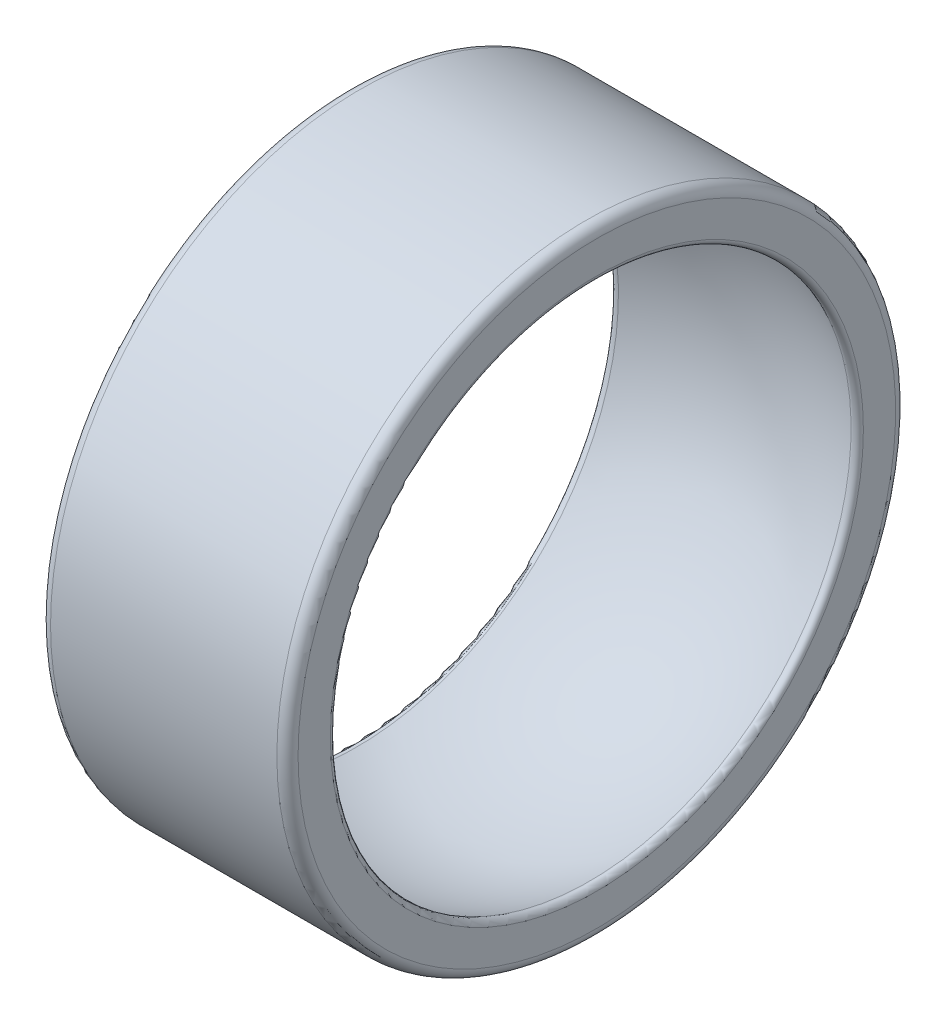
ISO-10303-21;
HEADER;
FILE_DESCRIPTION(('STEP AP214'),'2;1');
FILE_NAME('part.step','',(''),(''),'','','');
FILE_SCHEMA(('AUTOMOTIVE_DESIGN { 1 0 10303 214 1 1 1 1 }'));
ENDSEC;
DATA;
#1=APPLICATION_CONTEXT('core data for automotive mechanical design processes');
#2=APPLICATION_PROTOCOL_DEFINITION('international standard','automotive_design',2000,#1);
#3=PRODUCT_CONTEXT('',#1,'mechanical');
#4=PRODUCT('Part','Part','',(#3));
#5=PRODUCT_RELATED_PRODUCT_CATEGORY('part','',(#4));
#6=PRODUCT_DEFINITION_FORMATION('','',#4);
#7=PRODUCT_DEFINITION_CONTEXT('part definition',#1,'design');
#8=PRODUCT_DEFINITION('design','',#6,#7);
#9=PRODUCT_DEFINITION_SHAPE('','',#8);
#10=(LENGTH_UNIT() NAMED_UNIT(*) SI_UNIT(.MILLI.,.METRE.));
#11=(NAMED_UNIT(*) PLANE_ANGLE_UNIT() SI_UNIT($,.RADIAN.));
#12=(NAMED_UNIT(*) SI_UNIT($,.STERADIAN.) SOLID_ANGLE_UNIT());
#13=UNCERTAINTY_MEASURE_WITH_UNIT(LENGTH_MEASURE(1.E-05),#10,'distance_accuracy_value','');
#14=(GEOMETRIC_REPRESENTATION_CONTEXT(3) GLOBAL_UNCERTAINTY_ASSIGNED_CONTEXT((#13)) GLOBAL_UNIT_ASSIGNED_CONTEXT((#10,
#11,#12)) REPRESENTATION_CONTEXT('',''));
#15=CARTESIAN_POINT('',(0.,0.,0.));
#16=DIRECTION('',(0.,0.,1.));
#17=DIRECTION('',(1.,0.,0.));
#18=AXIS2_PLACEMENT_3D('',#15,#16,#17);
#19=CARTESIAN_POINT('',(0.6,0.,0.));
#20=DIRECTION('',(-1.,0.,0.));
#21=DIRECTION('',(0.,0.,1.));
#22=AXIS2_PLACEMENT_3D('',#19,#20,#21);
#23=TOROIDAL_SURFACE('',#22,16.9,0.6);
#24=CARTESIAN_POINT('',(0.,0.,0.));
#25=DIRECTION('',(-1.,0.,0.));
#26=DIRECTION('',(0.,0.,1.));
#27=AXIS2_PLACEMENT_3D('',#24,#25,#26);
#28=CIRCLE('',#27,16.9);
#29=CARTESIAN_POINT('',(0.,0.,16.9));
#30=VERTEX_POINT('',#29);
#31=EDGE_CURVE('E10',#30,#30,#28,.T.);
#32=ORIENTED_EDGE('',*,*,#31,.F.);
#33=EDGE_LOOP('',(#32));
#34=FACE_BOUND('',#33,.T.);
#35=CARTESIAN_POINT('',(0.6,0.,0.));
#36=DIRECTION('',(-1.,0.,0.));
#37=DIRECTION('',(0.,0.,1.));
#38=AXIS2_PLACEMENT_3D('',#35,#36,#37);
#39=CIRCLE('',#38,17.5);
#40=CARTESIAN_POINT('',(0.6,0.,17.5));
#41=VERTEX_POINT('',#40);
#42=EDGE_CURVE('E56',#41,#41,#39,.T.);
#43=ORIENTED_EDGE('',*,*,#42,.T.);
#44=EDGE_LOOP('',(#43));
#45=FACE_BOUND('',#44,.T.);
#46=ADVANCED_FACE('F14',(#34,#45),#23,.T.);
#47=CARTESIAN_POINT('',(0.,16.9,0.));
#48=DIRECTION('',(1.,0.,0.));
#49=DIRECTION('',(0.,0.,-1.));
#50=AXIS2_PLACEMENT_3D('',#47,#48,#49);
#51=PLANE('',#50);
#52=CARTESIAN_POINT('',(0.,0.,0.));
#53=DIRECTION('',(-1.,0.,0.));
#54=DIRECTION('',(0.,0.,1.));
#55=AXIS2_PLACEMENT_3D('',#52,#53,#54);
#56=CIRCLE('',#55,15.0753468294497);
#57=CARTESIAN_POINT('',(0.,0.,15.0753468294497));
#58=VERTEX_POINT('',#57);
#59=EDGE_CURVE('E21',#58,#58,#56,.T.);
#60=ORIENTED_EDGE('',*,*,#59,.F.);
#61=EDGE_LOOP('',(#60));
#62=FACE_BOUND('',#61,.T.);
#63=ORIENTED_EDGE('',*,*,#31,.T.);
#64=EDGE_LOOP('',(#63));
#65=FACE_BOUND('',#64,.T.);
#66=ADVANCED_FACE('F95',(#62,#65),#51,.F.);
#67=CARTESIAN_POINT('',(0.3,0.,0.));
#68=DIRECTION('',(-1.,0.,0.));
#69=DIRECTION('',(0.,0.,1.));
#70=AXIS2_PLACEMENT_3D('',#67,#68,#69);
#71=TOROIDAL_SURFACE('',#70,15.0753468294497,0.3);
#72=CARTESIAN_POINT('',(0.421839199040389,0.,0.));
#73=DIRECTION('',(-1.,0.,0.));
#74=DIRECTION('',(0.,0.,1.));
#75=AXIS2_PLACEMENT_3D('',#72,#73,#74);
#76=CIRCLE('',#75,14.8012023245309);
#77=CARTESIAN_POINT('',(0.421839199040389,14.8012023245309,0.));
#78=VERTEX_POINT('',#77);
#79=EDGE_CURVE('E30',#78,#78,#76,.T.);
#80=ORIENTED_EDGE('',*,*,#79,.F.);
#81=EDGE_LOOP('',(#80));
#82=FACE_BOUND('',#81,.T.);
#83=ORIENTED_EDGE('',*,*,#59,.T.);
#84=EDGE_LOOP('',(#83));
#85=FACE_BOUND('',#84,.T.);
#86=ADVANCED_FACE('F88',(#82,#85),#71,.T.);
#87=CARTESIAN_POINT('',(7.,0.,0.));
#88=DIRECTION('',(-1.,0.,0.));
#89=DIRECTION('',(0.,1.,0.));
#90=AXIS2_PLACEMENT_3D('',#87,#88,#89);
#91=SPHERICAL_SURFACE('',#90,16.1971537553664);
#92=CARTESIAN_POINT('',(13.5781608009596,0.,0.));
#93=DIRECTION('',(-1.,0.,0.));
#94=DIRECTION('',(0.,0.,1.));
#95=AXIS2_PLACEMENT_3D('',#92,#93,#94);
#96=CIRCLE('',#95,14.8012023245309);
#97=CARTESIAN_POINT('',(13.5781608009596,14.8012023245309,0.));
#98=VERTEX_POINT('',#97);
#99=EDGE_CURVE('E38',#98,#98,#96,.T.);
#100=CARTESIAN_POINT('',(0.421839199040389,14.8012023245309,0.));
#101=CARTESIAN_POINT('',(0.5507993703584,14.8585171326391,0.));
#102=CARTESIAN_POINT('',(0.680508939540277,14.9141457063211,0.));
#103=CARTESIAN_POINT('',(0.941337499032718,15.0219942170165,0.));
#104=CARTESIAN_POINT('',(1.07245648934328,15.0742141540299,0.));
#105=CARTESIAN_POINT('',(1.33601451649405,15.1752092235719,0.));
#106=CARTESIAN_POINT('',(1.46845355333426,15.2239843561005,0.));
#107=CARTESIAN_POINT('',(1.734561139108,15.3180566262618,0.));
#108=CARTESIAN_POINT('',(1.86822968804154,15.3633537638946,0.));
#109=CARTESIAN_POINT('',(2.13670499271805,15.4504390627608,0.));
#110=CARTESIAN_POINT('',(2.27151174846101,15.4922272239943,0.));
#111=CARTESIAN_POINT('',(2.54217136534652,15.5722660306264,0.));
#112=CARTESIAN_POINT('',(2.67802422648907,15.610516676025,0.));
#113=CARTESIAN_POINT('',(2.95068324304743,15.6834543163135,0.));
#114=CARTESIAN_POINT('',(3.08748939846324,15.7181413112033,0.));
#115=CARTESIAN_POINT('',(3.36196153983874,15.7839279536372,0.));
#116=CARTESIAN_POINT('',(3.49962752579843,15.8150276011812,0.));
#117=CARTESIAN_POINT('',(3.77572527746824,15.8736183020344,0.));
#118=CARTESIAN_POINT('',(3.91415704317837,15.9011093553435,0.));
#119=CARTESIAN_POINT('',(4.19169178029352,15.9524640863938,0.));
#120=CARTESIAN_POINT('',(4.33079475169853,15.9763277641349,0.));
#121=CARTESIAN_POINT('',(4.60957686761809,16.0204114408107,0.));
#122=CARTESIAN_POINT('',(4.74925601213263,16.0406314397452,0.));
#123=CARTESIAN_POINT('',(5.02909504804817,16.07741394488,0.));
#124=CARTESIAN_POINT('',(5.16925493944917,16.0939764510802,0.));
#125=CARTESIAN_POINT('',(5.44995971447896,16.1234326555458,0.));
#126=CARTESIAN_POINT('',(5.59050459810774,16.1363263538112,0.));
#127=CARTESIAN_POINT('',(5.87188333991434,16.15843613367,0.));
#128=CARTESIAN_POINT('',(6.01271719809214,16.1676522152635,0.));
#129=CARTESIAN_POINT('',(6.29457767389605,16.1824004655209,0.));
#130=CARTESIAN_POINT('',(6.43560429152215,16.1879326341849,0.));
#131=CARTESIAN_POINT('',(6.71775393943216,16.1953092791076,0.));
#132=CARTESIAN_POINT('',(6.85887696971608,16.1971537553664,0.));
#133=CARTESIAN_POINT('',(7.14112303028391,16.1971537553664,0.));
#134=CARTESIAN_POINT('',(7.28224606056783,16.1953092791076,0.));
#135=CARTESIAN_POINT('',(7.56439570847784,16.1879326341849,0.));
#136=CARTESIAN_POINT('',(7.70542232610394,16.1824004655209,0.));
#137=CARTESIAN_POINT('',(7.98728280190785,16.1676522152635,0.));
#138=CARTESIAN_POINT('',(8.12811666008565,16.15843613367,0.));
#139=CARTESIAN_POINT('',(8.40949540189225,16.1363263538112,0.));
#140=CARTESIAN_POINT('',(8.55004028552103,16.1234326555458,0.));
#141=CARTESIAN_POINT('',(8.83074506055082,16.0939764510802,0.));
#142=CARTESIAN_POINT('',(8.97090495195182,16.07741394488,0.));
#143=CARTESIAN_POINT('',(9.25074398786736,16.0406314397452,0.));
#144=CARTESIAN_POINT('',(9.3904231323819,16.0204114408107,0.));
#145=CARTESIAN_POINT('',(9.66920524830146,15.9763277641349,0.));
#146=CARTESIAN_POINT('',(9.80830821970647,15.9524640863938,0.));
#147=CARTESIAN_POINT('',(10.0858429568216,15.9011093553435,0.));
#148=CARTESIAN_POINT('',(10.2242747225317,15.8736183020344,0.));
#149=CARTESIAN_POINT('',(10.5003724742016,15.8150276011812,0.));
#150=CARTESIAN_POINT('',(10.6380384601612,15.7839279536372,0.));
#151=CARTESIAN_POINT('',(10.9125106015368,15.7181413112033,0.));
#152=CARTESIAN_POINT('',(11.0493167569526,15.6834543163135,0.));
#153=CARTESIAN_POINT('',(11.3219757735109,15.610516676025,0.));
#154=CARTESIAN_POINT('',(11.4578286346535,15.5722660306264,0.));
#155=CARTESIAN_POINT('',(11.728488251539,15.4922272239943,0.));
#156=CARTESIAN_POINT('',(11.8632950072819,15.4504390627608,0.));
#157=CARTESIAN_POINT('',(12.1317703119584,15.3633537638946,0.));
#158=CARTESIAN_POINT('',(12.265438860892,15.3180566262618,0.));
#159=CARTESIAN_POINT('',(12.5315464466657,15.2239843561005,0.));
#160=CARTESIAN_POINT('',(12.6639854835059,15.1752092235719,0.));
#161=CARTESIAN_POINT('',(12.9275435106567,15.0742141540299,0.));
#162=CARTESIAN_POINT('',(13.0586625009673,15.0219942170165,0.));
#163=CARTESIAN_POINT('',(13.3194910604597,14.9141457063211,0.));
#164=CARTESIAN_POINT('',(13.4492006296416,14.8585171326391,0.));
#165=CARTESIAN_POINT('',(13.5781608009596,14.8012023245309,0.));
#166=B_SPLINE_CURVE_WITH_KNOTS('',3,(#100,#101,#102,#103,#104,#105,#106,#107,#108,#109,#110,
#111,#112,#113,#114,#115,#116,#117,#118,#119,#120,#121,#122,#123,#124,#125,#126,#127,#128,#129,
#130,#131,#132,#133,#134,#135,#136,#137,#138,#139,#140,#141,#142,#143,#144,#145,#146,#147,#148,
#149,#150,#151,#152,#153,#154,#155,#156,#157,#158,#159,#160,#161,#162,#163,#164,#165),
.UNSPECIFIED.,.F.,.F.,(4,2,2,2,2,2,2,2,2,2,2,2,2,2,2,2,2,2,2,2,2,2,2,2,2,2,2,2,2,2,2,2,4),(0.,
0.423357039784244,0.846714079568487,1.27007111935273,1.69342815913698,2.11678519892122,
2.54014223870547,2.96349927848971,3.38685631827395,3.8102133580582,4.23357039784244,
4.65692743762669,5.08028447741093,5.50364151719518,5.92699855697942,6.35035559676367,
6.77371263654791,7.19706967633215,7.6204267161164,8.04378375590064,8.46714079568489,
8.89049783546913,9.31385487525337,9.73721191503762,10.1605689548219,10.5839259946061,
11.0072830343904,11.4306400741746,11.8539971139588,12.2773541537431,12.7007111935273,
13.1240682333116,13.5474252730958),.UNSPECIFIED.);
#167=EDGE_CURVE('BSEAM83',#78,#98,#166,.T.);
#168=ORIENTED_EDGE('',*,*,#79,.T.);
#169=ORIENTED_EDGE('',*,*,#99,.F.);
#170=ORIENTED_EDGE('',*,*,#167,.T.);
#171=ORIENTED_EDGE('',*,*,#167,.F.);
#172=EDGE_LOOP('',(#168,#170,#169,#171));
#173=FACE_BOUND('',#172,.T.);
#174=ADVANCED_FACE('F83',(#173),#91,.F.);
#175=CARTESIAN_POINT('',(13.7,0.,0.));
#176=DIRECTION('',(-1.,0.,0.));
#177=DIRECTION('',(0.,0.,1.));
#178=AXIS2_PLACEMENT_3D('',#175,#176,#177);
#179=TOROIDAL_SURFACE('',#178,15.0753468294497,0.3);
#180=CARTESIAN_POINT('',(14.,0.,0.));
#181=DIRECTION('',(-1.,0.,0.));
#182=DIRECTION('',(0.,0.,1.));
#183=AXIS2_PLACEMENT_3D('',#180,#181,#182);
#184=CIRCLE('',#183,15.0753468294497);
#185=CARTESIAN_POINT('',(14.,0.,15.0753468294497));
#186=VERTEX_POINT('',#185);
#187=EDGE_CURVE('E44',#186,#186,#184,.T.);
#188=ORIENTED_EDGE('',*,*,#187,.F.);
#189=EDGE_LOOP('',(#188));
#190=FACE_BOUND('',#189,.T.);
#191=ORIENTED_EDGE('',*,*,#99,.T.);
#192=EDGE_LOOP('',(#191));
#193=FACE_BOUND('',#192,.T.);
#194=ADVANCED_FACE('F77',(#190,#193),#179,.T.);
#195=CARTESIAN_POINT('',(14.,15.0753468294497,0.));
#196=DIRECTION('',(-1.,0.,0.));
#197=DIRECTION('',(0.,0.,1.));
#198=AXIS2_PLACEMENT_3D('',#195,#196,#197);
#199=PLANE('',#198);
#200=CARTESIAN_POINT('',(14.,0.,0.));
#201=DIRECTION('',(-1.,0.,0.));
#202=DIRECTION('',(0.,0.,1.));
#203=AXIS2_PLACEMENT_3D('',#200,#201,#202);
#204=CIRCLE('',#203,16.9);
#205=CARTESIAN_POINT('',(14.,0.,16.9));
#206=VERTEX_POINT('',#205);
#207=EDGE_CURVE('E48',#206,#206,#204,.T.);
#208=ORIENTED_EDGE('',*,*,#207,.F.);
#209=EDGE_LOOP('',(#208));
#210=FACE_BOUND('',#209,.T.);
#211=ORIENTED_EDGE('',*,*,#187,.T.);
#212=EDGE_LOOP('',(#211));
#213=FACE_BOUND('',#212,.T.);
#214=ADVANCED_FACE('F71',(#210,#213),#199,.F.);
#215=CARTESIAN_POINT('',(13.4,0.,0.));
#216=DIRECTION('',(-1.,0.,0.));
#217=DIRECTION('',(0.,0.,1.));
#218=AXIS2_PLACEMENT_3D('',#215,#216,#217);
#219=TOROIDAL_SURFACE('',#218,16.9,0.6);
#220=CARTESIAN_POINT('',(13.4,0.,0.));
#221=DIRECTION('',(-1.,0.,0.));
#222=DIRECTION('',(0.,0.,1.));
#223=AXIS2_PLACEMENT_3D('',#220,#221,#222);
#224=CIRCLE('',#223,17.5);
#225=CARTESIAN_POINT('',(13.4,0.,17.5));
#226=VERTEX_POINT('',#225);
#227=EDGE_CURVE('E52',#226,#226,#224,.T.);
#228=ORIENTED_EDGE('',*,*,#227,.F.);
#229=EDGE_LOOP('',(#228));
#230=FACE_BOUND('',#229,.T.);
#231=ORIENTED_EDGE('',*,*,#207,.T.);
#232=EDGE_LOOP('',(#231));
#233=FACE_BOUND('',#232,.T.);
#234=ADVANCED_FACE('F65',(#230,#233),#219,.T.);
#235=CARTESIAN_POINT('',(0.,0.,0.));
#236=DIRECTION('',(-1.,0.,0.));
#237=DIRECTION('',(0.,0.,1.));
#238=AXIS2_PLACEMENT_3D('',#235,#236,#237);
#239=CYLINDRICAL_SURFACE('',#238,17.5);
#240=ORIENTED_EDGE('',*,*,#42,.F.);
#241=EDGE_LOOP('',(#240));
#242=FACE_BOUND('',#241,.T.);
#243=ORIENTED_EDGE('',*,*,#227,.T.);
#244=EDGE_LOOP('',(#243));
#245=FACE_BOUND('',#244,.T.);
#246=ADVANCED_FACE('F62',(#242,#245),#239,.T.);
#247=CLOSED_SHELL('',(#46,#66,#86,#174,#194,#214,#234,#246));
#248=MANIFOLD_SOLID_BREP('B1',#247);
#249=ADVANCED_BREP_SHAPE_REPRESENTATION('',(#18,#248),#14);
#250=SHAPE_DEFINITION_REPRESENTATION(#9,#249);
ENDSEC;
END-ISO-10303-21;
